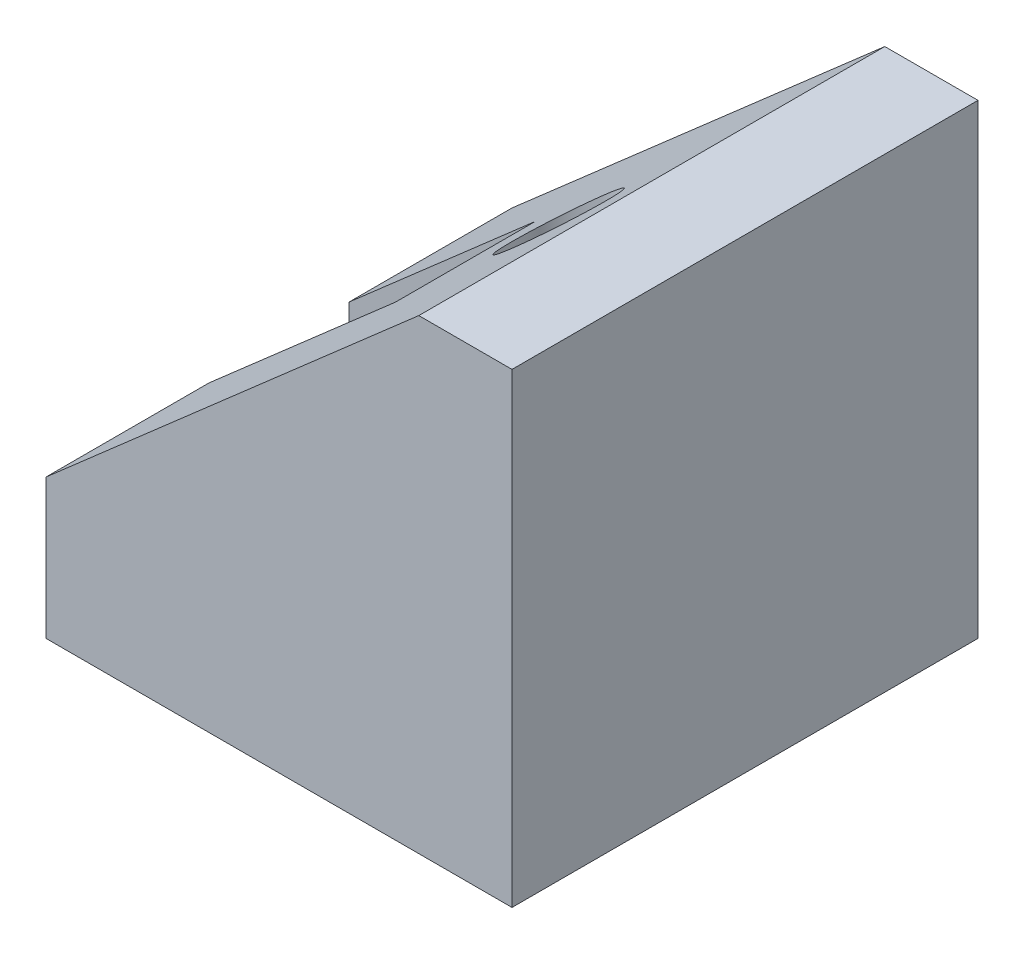
ISO-10303-21;
HEADER;
FILE_DESCRIPTION(('STEP AP214'),'2;1');
FILE_NAME('part.step','',(''),(''),'','','');
FILE_SCHEMA(('AUTOMOTIVE_DESIGN { 1 0 10303 214 1 1 1 1 }'));
ENDSEC;
DATA;
#1=APPLICATION_CONTEXT('core data for automotive mechanical design processes');
#2=APPLICATION_PROTOCOL_DEFINITION('international standard','automotive_design',2000,#1);
#3=PRODUCT_CONTEXT('',#1,'mechanical');
#4=PRODUCT('Part','Part','',(#3));
#5=PRODUCT_RELATED_PRODUCT_CATEGORY('part','',(#4));
#6=PRODUCT_DEFINITION_FORMATION('','',#4);
#7=PRODUCT_DEFINITION_CONTEXT('part definition',#1,'design');
#8=PRODUCT_DEFINITION('design','',#6,#7);
#9=PRODUCT_DEFINITION_SHAPE('','',#8);
#10=(LENGTH_UNIT() NAMED_UNIT(*) SI_UNIT(.MILLI.,.METRE.));
#11=(NAMED_UNIT(*) PLANE_ANGLE_UNIT() SI_UNIT($,.RADIAN.));
#12=(NAMED_UNIT(*) SI_UNIT($,.STERADIAN.) SOLID_ANGLE_UNIT());
#13=UNCERTAINTY_MEASURE_WITH_UNIT(LENGTH_MEASURE(1.E-05),#10,'distance_accuracy_value','');
#14=(GEOMETRIC_REPRESENTATION_CONTEXT(3) GLOBAL_UNCERTAINTY_ASSIGNED_CONTEXT((#13)) GLOBAL_UNIT_ASSIGNED_CONTEXT((#10,
#11,#12)) REPRESENTATION_CONTEXT('',''));
#15=CARTESIAN_POINT('',(0.,0.,0.));
#16=DIRECTION('',(0.,0.,1.));
#17=DIRECTION('',(1.,0.,0.));
#18=AXIS2_PLACEMENT_3D('',#15,#16,#17);
#19=CARTESIAN_POINT('',(0.,0.,50.));
#20=DIRECTION('',(0.,1.,0.));
#21=DIRECTION('',(0.,0.,1.));
#22=AXIS2_PLACEMENT_3D('',#19,#20,#21);
#23=PLANE('',#22);
#24=CARTESIAN_POINT('',(30.,0.,25.));
#25=DIRECTION('',(0.,-1.,0.));
#26=DIRECTION('',(0.,0.,-1.));
#27=AXIS2_PLACEMENT_3D('',#24,#25,#26);
#28=CIRCLE('',#27,5.);
#29=CARTESIAN_POINT('',(30.,0.,20.));
#30=VERTEX_POINT('',#29);
#31=EDGE_CURVE('E144',#30,#30,#28,.T.);
#32=ORIENTED_EDGE('',*,*,#31,.F.);
#33=EDGE_LOOP('',(#32));
#34=FACE_BOUND('',#33,.T.);
#35=DIRECTION('',(1.,0.,0.));
#36=VECTOR('',#35,1.);
#37=CARTESIAN_POINT('',(0.,0.,32.5));
#38=LINE('',#37,#36);
#39=CARTESIAN_POINT('',(0.,0.,32.5));
#40=VERTEX_POINT('',#39);
#41=CARTESIAN_POINT('',(20.,0.,32.5));
#42=VERTEX_POINT('',#41);
#43=EDGE_CURVE('E157',#40,#42,#38,.T.);
#44=ORIENTED_EDGE('',*,*,#43,.T.);
#45=DIRECTION('',(0.,0.,-1.));
#46=VECTOR('',#45,1.);
#47=CARTESIAN_POINT('',(20.,0.,32.5));
#48=LINE('',#47,#46);
#49=CARTESIAN_POINT('',(20.,0.,17.5));
#50=VERTEX_POINT('',#49);
#51=EDGE_CURVE('E176',#42,#50,#48,.T.);
#52=ORIENTED_EDGE('',*,*,#51,.T.);
#53=DIRECTION('',(-1.,0.,0.));
#54=VECTOR('',#53,1.);
#55=CARTESIAN_POINT('',(20.,0.,17.5));
#56=LINE('',#55,#54);
#57=CARTESIAN_POINT('',(0.,0.,17.5));
#58=VERTEX_POINT('',#57);
#59=EDGE_CURVE('E174',#50,#58,#56,.T.);
#60=ORIENTED_EDGE('',*,*,#59,.T.);
#61=DIRECTION('',(0.,0.,-1.));
#62=VECTOR('',#61,1.);
#63=CARTESIAN_POINT('',(0.,0.,50.));
#64=LINE('',#63,#62);
#65=CARTESIAN_POINT('',(0.,0.,0.));
#66=VERTEX_POINT('',#65);
#67=EDGE_CURVE('E80',#58,#66,#64,.T.);
#68=ORIENTED_EDGE('',*,*,#67,.T.);
#69=DIRECTION('',(1.,0.,0.));
#70=VECTOR('',#69,1.);
#71=CARTESIAN_POINT('',(0.,0.,0.));
#72=LINE('',#71,#70);
#73=CARTESIAN_POINT('',(50.,0.,0.));
#74=VERTEX_POINT('',#73);
#75=EDGE_CURVE('E122',#66,#74,#72,.T.);
#76=ORIENTED_EDGE('',*,*,#75,.T.);
#77=DIRECTION('',(0.,0.,-1.));
#78=VECTOR('',#77,1.);
#79=CARTESIAN_POINT('',(50.,0.,50.));
#80=LINE('',#79,#78);
#81=CARTESIAN_POINT('',(50.,0.,50.));
#82=VERTEX_POINT('',#81);
#83=EDGE_CURVE('E139',#82,#74,#80,.T.);
#84=ORIENTED_EDGE('',*,*,#83,.F.);
#85=DIRECTION('',(1.,0.,0.));
#86=VECTOR('',#85,1.);
#87=CARTESIAN_POINT('',(0.,0.,50.));
#88=LINE('',#87,#86);
#89=CARTESIAN_POINT('',(0.,0.,50.));
#90=VERTEX_POINT('',#89);
#91=EDGE_CURVE('E132',#90,#82,#88,.T.);
#92=ORIENTED_EDGE('',*,*,#91,.F.);
#93=EDGE_CURVE('E133',#90,#40,#64,.T.);
#94=ORIENTED_EDGE('',*,*,#93,.T.);
#95=EDGE_LOOP('',(#44,#52,#60,#68,#76,#84,#92,#94));
#96=FACE_BOUND('',#95,.T.);
#97=ADVANCED_FACE('F32',(#34,#96),#23,.F.);
#98=CARTESIAN_POINT('',(40.,50.,50.));
#99=DIRECTION('',(0.658504607868518,-0.752576694706878,0.));
#100=DIRECTION('',(0.752576694706878,0.658504607868518,0.));
#101=AXIS2_PLACEMENT_3D('',#98,#99,#100);
#102=PLANE('',#101);
#103=CARTESIAN_POINT('',(30.,41.25,25.));
#104=DIRECTION('',(0.658504607868518,-0.752576694706878,0.));
#105=DIRECTION('',(-0.752576694706878,-0.658504607868518,0.));
#106=AXIS2_PLACEMENT_3D('',#103,#104,#105);
#107=ELLIPSE('',#106,6.64384113295916,5.);
#108=CARTESIAN_POINT('',(25.,36.875,25.));
#109=VERTEX_POINT('',#108);
#110=EDGE_CURVE('E125',#109,#109,#107,.T.);
#111=ORIENTED_EDGE('',*,*,#110,.T.);
#112=EDGE_LOOP('',(#111));
#113=FACE_BOUND('',#112,.T.);
#114=DIRECTION('',(0.752576694706878,0.658504607868518,0.));
#115=VECTOR('',#114,1.);
#116=CARTESIAN_POINT('',(40.,50.,32.5));
#117=LINE('',#116,#115);
#118=CARTESIAN_POINT('',(0.,15.,32.5));
#119=VERTEX_POINT('',#118);
#120=CARTESIAN_POINT('',(20.,32.5,32.5));
#121=VERTEX_POINT('',#120);
#122=EDGE_CURVE('E153',#119,#121,#117,.T.);
#123=ORIENTED_EDGE('',*,*,#122,.F.);
#124=DIRECTION('',(0.,0.,-1.));
#125=VECTOR('',#124,1.);
#126=CARTESIAN_POINT('',(0.,15.,50.));
#127=LINE('',#126,#125);
#128=CARTESIAN_POINT('',(0.,15.,50.));
#129=VERTEX_POINT('',#128);
#130=EDGE_CURVE('E113',#129,#119,#127,.T.);
#131=ORIENTED_EDGE('',*,*,#130,.F.);
#132=DIRECTION('',(-0.752576694706878,-0.658504607868518,0.));
#133=VECTOR('',#132,1.);
#134=CARTESIAN_POINT('',(40.,50.,50.));
#135=LINE('',#134,#133);
#136=CARTESIAN_POINT('',(40.,50.,50.));
#137=VERTEX_POINT('',#136);
#138=EDGE_CURVE('E99',#137,#129,#135,.T.);
#139=ORIENTED_EDGE('',*,*,#138,.F.);
#140=DIRECTION('',(0.,0.,-1.));
#141=VECTOR('',#140,1.);
#142=CARTESIAN_POINT('',(40.,50.,50.));
#143=LINE('',#142,#141);
#144=CARTESIAN_POINT('',(40.,50.,0.));
#145=VERTEX_POINT('',#144);
#146=EDGE_CURVE('E105',#137,#145,#143,.T.);
#147=ORIENTED_EDGE('',*,*,#146,.T.);
#148=DIRECTION('',(-0.752576694706878,-0.658504607868518,0.));
#149=VECTOR('',#148,1.);
#150=CARTESIAN_POINT('',(40.,50.,0.));
#151=LINE('',#150,#149);
#152=CARTESIAN_POINT('',(0.,15.,0.));
#153=VERTEX_POINT('',#152);
#154=EDGE_CURVE('E128',#145,#153,#151,.T.);
#155=ORIENTED_EDGE('',*,*,#154,.T.);
#156=CARTESIAN_POINT('',(0.,15.,17.5));
#157=VERTEX_POINT('',#156);
#158=EDGE_CURVE('E136',#157,#153,#127,.T.);
#159=ORIENTED_EDGE('',*,*,#158,.F.);
#160=DIRECTION('',(-0.752576694706878,-0.658504607868518,0.));
#161=VECTOR('',#160,1.);
#162=CARTESIAN_POINT('',(40.,50.,17.5));
#163=LINE('',#162,#161);
#164=CARTESIAN_POINT('',(20.,32.5,17.5));
#165=VERTEX_POINT('',#164);
#166=EDGE_CURVE('E46',#165,#157,#163,.T.);
#167=ORIENTED_EDGE('',*,*,#166,.F.);
#168=DIRECTION('',(0.,0.,-1.));
#169=VECTOR('',#168,1.);
#170=CARTESIAN_POINT('',(20.,32.5,50.));
#171=LINE('',#170,#169);
#172=EDGE_CURVE('E11',#121,#165,#171,.T.);
#173=ORIENTED_EDGE('',*,*,#172,.F.);
#174=EDGE_LOOP('',(#123,#131,#139,#147,#155,#159,#167,#173));
#175=FACE_BOUND('',#174,.T.);
#176=ADVANCED_FACE('F116',(#113,#175),#102,.F.);
#177=CARTESIAN_POINT('',(0.,0.,50.));
#178=DIRECTION('',(1.,0.,0.));
#179=DIRECTION('',(0.,0.,-1.));
#180=AXIS2_PLACEMENT_3D('',#177,#178,#179);
#181=PLANE('',#180);
#182=DIRECTION('',(0.,1.,0.));
#183=VECTOR('',#182,1.);
#184=CARTESIAN_POINT('',(0.,0.,32.5));
#185=LINE('',#184,#183);
#186=EDGE_CURVE('E39',#40,#119,#185,.T.);
#187=ORIENTED_EDGE('',*,*,#186,.F.);
#188=ORIENTED_EDGE('',*,*,#93,.F.);
#189=DIRECTION('',(0.,-1.,0.));
#190=VECTOR('',#189,1.);
#191=CARTESIAN_POINT('',(0.,0.,50.));
#192=LINE('',#191,#190);
#193=EDGE_CURVE('E55',#129,#90,#192,.T.);
#194=ORIENTED_EDGE('',*,*,#193,.F.);
#195=ORIENTED_EDGE('',*,*,#130,.T.);
#196=EDGE_LOOP('',(#187,#188,#194,#195));
#197=FACE_BOUND('',#196,.T.);
#198=ADVANCED_FACE('F161',(#197),#181,.F.);
#199=DIRECTION('',(0.,-1.,0.));
#200=VECTOR('',#199,1.);
#201=CARTESIAN_POINT('',(0.,0.,17.5));
#202=LINE('',#201,#200);
#203=EDGE_CURVE('E141',#157,#58,#202,.T.);
#204=ORIENTED_EDGE('',*,*,#203,.F.);
#205=ORIENTED_EDGE('',*,*,#158,.T.);
#206=DIRECTION('',(0.,-1.,0.));
#207=VECTOR('',#206,1.);
#208=CARTESIAN_POINT('',(0.,0.,0.));
#209=LINE('',#208,#207);
#210=EDGE_CURVE('E130',#153,#66,#209,.T.);
#211=ORIENTED_EDGE('',*,*,#210,.T.);
#212=ORIENTED_EDGE('',*,*,#67,.F.);
#213=EDGE_LOOP('',(#204,#205,#211,#212));
#214=FACE_BOUND('',#213,.T.);
#215=ADVANCED_FACE('F196',(#214),#181,.F.);
#216=CARTESIAN_POINT('',(50.,0.,50.));
#217=DIRECTION('',(-1.,0.,0.));
#218=DIRECTION('',(0.,0.,1.));
#219=AXIS2_PLACEMENT_3D('',#216,#217,#218);
#220=PLANE('',#219);
#221=DIRECTION('',(0.,1.,0.));
#222=VECTOR('',#221,1.);
#223=CARTESIAN_POINT('',(50.,0.,0.));
#224=LINE('',#223,#222);
#225=CARTESIAN_POINT('',(50.,50.,0.));
#226=VERTEX_POINT('',#225);
#227=EDGE_CURVE('E124',#74,#226,#224,.T.);
#228=ORIENTED_EDGE('',*,*,#227,.T.);
#229=DIRECTION('',(0.,0.,-1.));
#230=VECTOR('',#229,1.);
#231=CARTESIAN_POINT('',(50.,50.,50.));
#232=LINE('',#231,#230);
#233=CARTESIAN_POINT('',(50.,50.,50.));
#234=VERTEX_POINT('',#233);
#235=EDGE_CURVE('E112',#234,#226,#232,.T.);
#236=ORIENTED_EDGE('',*,*,#235,.F.);
#237=DIRECTION('',(0.,1.,0.));
#238=VECTOR('',#237,1.);
#239=CARTESIAN_POINT('',(50.,0.,50.));
#240=LINE('',#239,#238);
#241=EDGE_CURVE('E89',#82,#234,#240,.T.);
#242=ORIENTED_EDGE('',*,*,#241,.F.);
#243=ORIENTED_EDGE('',*,*,#83,.T.);
#244=EDGE_LOOP('',(#228,#236,#242,#243));
#245=FACE_BOUND('',#244,.T.);
#246=ADVANCED_FACE('F200',(#245),#220,.F.);
#247=CARTESIAN_POINT('',(50.,50.,50.));
#248=DIRECTION('',(0.,-1.,0.));
#249=DIRECTION('',(0.,0.,-1.));
#250=AXIS2_PLACEMENT_3D('',#247,#248,#249);
#251=PLANE('',#250);
#252=DIRECTION('',(-1.,0.,0.));
#253=VECTOR('',#252,1.);
#254=CARTESIAN_POINT('',(50.,50.,0.));
#255=LINE('',#254,#253);
#256=EDGE_CURVE('E108',#226,#145,#255,.T.);
#257=ORIENTED_EDGE('',*,*,#256,.T.);
#258=ORIENTED_EDGE('',*,*,#146,.F.);
#259=DIRECTION('',(-1.,0.,0.));
#260=VECTOR('',#259,1.);
#261=CARTESIAN_POINT('',(50.,50.,50.));
#262=LINE('',#261,#260);
#263=EDGE_CURVE('E95',#234,#137,#262,.T.);
#264=ORIENTED_EDGE('',*,*,#263,.F.);
#265=ORIENTED_EDGE('',*,*,#235,.T.);
#266=EDGE_LOOP('',(#257,#258,#264,#265));
#267=FACE_BOUND('',#266,.T.);
#268=ADVANCED_FACE('F106',(#267),#251,.F.);
#269=CARTESIAN_POINT('',(0.,0.,50.));
#270=DIRECTION('',(0.,0.,1.));
#271=DIRECTION('',(1.,0.,0.));
#272=AXIS2_PLACEMENT_3D('',#269,#270,#271);
#273=PLANE('',#272);
#274=ORIENTED_EDGE('',*,*,#91,.T.);
#275=ORIENTED_EDGE('',*,*,#241,.T.);
#276=ORIENTED_EDGE('',*,*,#263,.T.);
#277=ORIENTED_EDGE('',*,*,#138,.T.);
#278=ORIENTED_EDGE('',*,*,#193,.T.);
#279=EDGE_LOOP('',(#274,#275,#276,#277,#278));
#280=FACE_BOUND('',#279,.T.);
#281=ADVANCED_FACE('F97',(#280),#273,.T.);
#282=CARTESIAN_POINT('',(0.,0.,0.));
#283=DIRECTION('',(0.,0.,1.));
#284=DIRECTION('',(1.,0.,0.));
#285=AXIS2_PLACEMENT_3D('',#282,#283,#284);
#286=PLANE('',#285);
#287=ORIENTED_EDGE('',*,*,#75,.F.);
#288=ORIENTED_EDGE('',*,*,#210,.F.);
#289=ORIENTED_EDGE('',*,*,#154,.F.);
#290=ORIENTED_EDGE('',*,*,#256,.F.);
#291=ORIENTED_EDGE('',*,*,#227,.F.);
#292=EDGE_LOOP('',(#287,#288,#289,#290,#291));
#293=FACE_BOUND('',#292,.T.);
#294=ADVANCED_FACE('F199',(#293),#286,.F.);
#295=CARTESIAN_POINT('',(30.,50.,25.));
#296=DIRECTION('',(0.,-1.,0.));
#297=DIRECTION('',(0.,0.,-1.));
#298=AXIS2_PLACEMENT_3D('',#295,#296,#297);
#299=CYLINDRICAL_SURFACE('',#298,5.);
#300=ORIENTED_EDGE('',*,*,#31,.T.);
#301=EDGE_LOOP('',(#300));
#302=FACE_BOUND('',#301,.T.);
#303=ORIENTED_EDGE('',*,*,#110,.F.);
#304=EDGE_LOOP('',(#303));
#305=FACE_BOUND('',#304,.T.);
#306=ADVANCED_FACE('F217',(#302,#305),#299,.F.);
#307=CARTESIAN_POINT('',(20.,50.,32.5));
#308=DIRECTION('',(-1.,0.,0.));
#309=DIRECTION('',(0.,0.,1.));
#310=AXIS2_PLACEMENT_3D('',#307,#308,#309);
#311=PLANE('',#310);
#312=ORIENTED_EDGE('',*,*,#172,.T.);
#313=DIRECTION('',(0.,-1.,0.));
#314=VECTOR('',#313,1.);
#315=CARTESIAN_POINT('',(20.,50.,17.5));
#316=LINE('',#315,#314);
#317=EDGE_CURVE('E171',#165,#50,#316,.T.);
#318=ORIENTED_EDGE('',*,*,#317,.T.);
#319=ORIENTED_EDGE('',*,*,#51,.F.);
#320=DIRECTION('',(0.,-1.,0.));
#321=VECTOR('',#320,1.);
#322=CARTESIAN_POINT('',(20.,50.,32.5));
#323=LINE('',#322,#321);
#324=EDGE_CURVE('E169',#121,#42,#323,.T.);
#325=ORIENTED_EDGE('',*,*,#324,.F.);
#326=EDGE_LOOP('',(#312,#318,#319,#325));
#327=FACE_BOUND('',#326,.T.);
#328=ADVANCED_FACE('F190',(#327),#311,.T.);
#329=CARTESIAN_POINT('',(0.,50.,32.5));
#330=DIRECTION('',(0.,0.,-1.));
#331=DIRECTION('',(-1.,0.,0.));
#332=AXIS2_PLACEMENT_3D('',#329,#330,#331);
#333=PLANE('',#332);
#334=ORIENTED_EDGE('',*,*,#122,.T.);
#335=ORIENTED_EDGE('',*,*,#324,.T.);
#336=ORIENTED_EDGE('',*,*,#43,.F.);
#337=ORIENTED_EDGE('',*,*,#186,.T.);
#338=EDGE_LOOP('',(#334,#335,#336,#337));
#339=FACE_BOUND('',#338,.T.);
#340=ADVANCED_FACE('F150',(#339),#333,.T.);
#341=CARTESIAN_POINT('',(20.,50.,17.5));
#342=DIRECTION('',(0.,0.,1.));
#343=DIRECTION('',(1.,0.,0.));
#344=AXIS2_PLACEMENT_3D('',#341,#342,#343);
#345=PLANE('',#344);
#346=ORIENTED_EDGE('',*,*,#166,.T.);
#347=ORIENTED_EDGE('',*,*,#203,.T.);
#348=ORIENTED_EDGE('',*,*,#59,.F.);
#349=ORIENTED_EDGE('',*,*,#317,.F.);
#350=EDGE_LOOP('',(#346,#347,#348,#349));
#351=FACE_BOUND('',#350,.T.);
#352=ADVANCED_FACE('F192',(#351),#345,.T.);
#353=CLOSED_SHELL('',(#97,#176,#198,#215,#246,#268,#281,#294,#306,#328,#340,#352));
#354=MANIFOLD_SOLID_BREP('B2',#353);
#355=ADVANCED_BREP_SHAPE_REPRESENTATION('',(#18,#354),#14);
#356=SHAPE_DEFINITION_REPRESENTATION(#9,#355);
ENDSEC;
END-ISO-10303-21;
